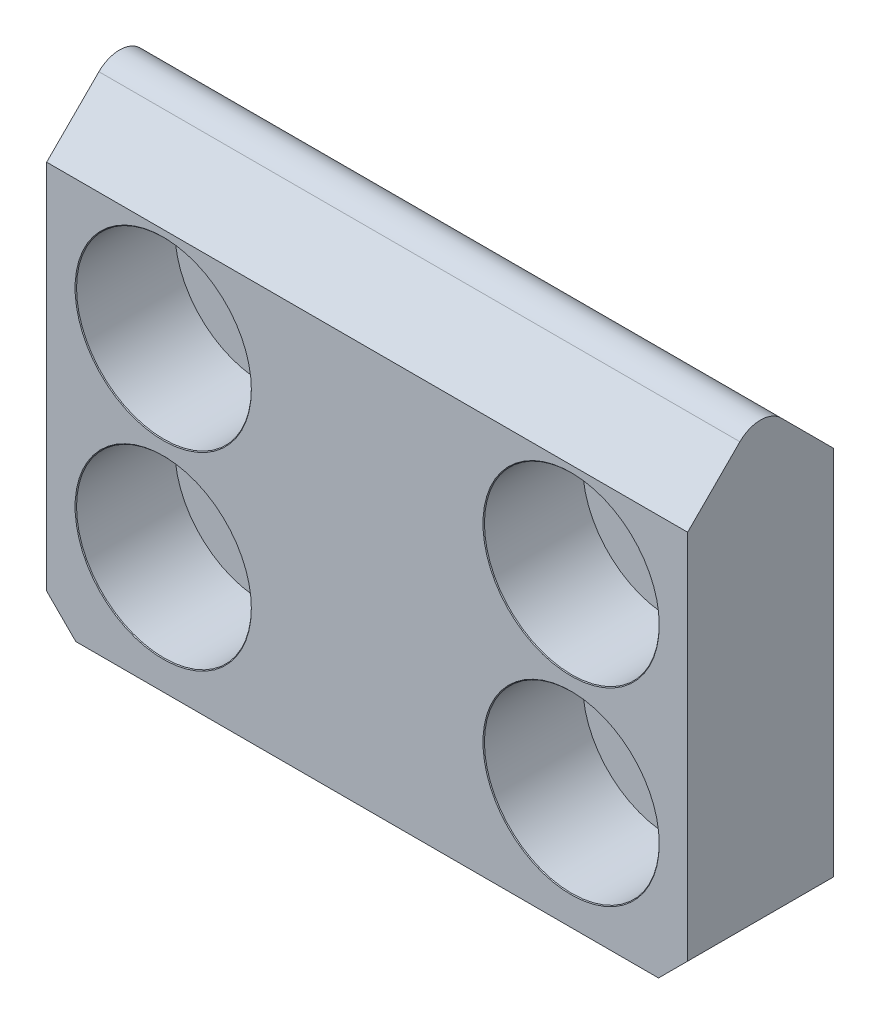
ISO-10303-21;
HEADER;
FILE_DESCRIPTION(('STEP AP214'),'2;1');
FILE_NAME('part.step','',(''),(''),'','','');
FILE_SCHEMA(('AUTOMOTIVE_DESIGN { 1 0 10303 214 1 1 1 1 }'));
ENDSEC;
DATA;
#1=APPLICATION_CONTEXT('core data for automotive mechanical design processes');
#2=APPLICATION_PROTOCOL_DEFINITION('international standard','automotive_design',2000,#1);
#3=PRODUCT_CONTEXT('',#1,'mechanical');
#4=PRODUCT('Part','Part','',(#3));
#5=PRODUCT_RELATED_PRODUCT_CATEGORY('part','',(#4));
#6=PRODUCT_DEFINITION_FORMATION('','',#4);
#7=PRODUCT_DEFINITION_CONTEXT('part definition',#1,'design');
#8=PRODUCT_DEFINITION('design','',#6,#7);
#9=PRODUCT_DEFINITION_SHAPE('','',#8);
#10=(LENGTH_UNIT() NAMED_UNIT(*) SI_UNIT(.MILLI.,.METRE.));
#11=(NAMED_UNIT(*) PLANE_ANGLE_UNIT() SI_UNIT($,.RADIAN.));
#12=(NAMED_UNIT(*) SI_UNIT($,.STERADIAN.) SOLID_ANGLE_UNIT());
#13=UNCERTAINTY_MEASURE_WITH_UNIT(LENGTH_MEASURE(1.E-05),#10,'distance_accuracy_value','');
#14=(GEOMETRIC_REPRESENTATION_CONTEXT(3) GLOBAL_UNCERTAINTY_ASSIGNED_CONTEXT((#13)) GLOBAL_UNIT_ASSIGNED_CONTEXT((#10,
#11,#12)) REPRESENTATION_CONTEXT('',''));
#15=CARTESIAN_POINT('',(0.,0.,0.));
#16=DIRECTION('',(0.,0.,1.));
#17=DIRECTION('',(1.,0.,0.));
#18=AXIS2_PLACEMENT_3D('',#15,#16,#17);
#19=CARTESIAN_POINT('',(11.,-11.25,5.));
#20=DIRECTION('',(-1.,0.,0.));
#21=DIRECTION('',(0.,-1.,0.));
#22=AXIS2_PLACEMENT_3D('',#19,#20,#21);
#23=PLANE('',#22);
#24=DIRECTION('',(0.,-0.707106781186549,-0.707106781186547));
#25=VECTOR('',#24,1.);
#26=CARTESIAN_POINT('',(11.,5.,2.50000000000001));
#27=LINE('',#26,#25);
#28=CARTESIAN_POINT('',(11.,2.49999999999999,0.));
#29=VERTEX_POINT('',#28);
#30=CARTESIAN_POINT('',(11.,4.29289321881344,1.79289321881345));
#31=VERTEX_POINT('',#30);
#32=EDGE_CURVE('E133',#29,#31,#27,.F.);
#33=ORIENTED_EDGE('',*,*,#32,.T.);
#34=CARTESIAN_POINT('',(11.,3.5857864376269,2.5));
#35=DIRECTION('',(-1.,0.,0.));
#36=DIRECTION('',(0.,-1.,0.));
#37=AXIS2_PLACEMENT_3D('',#34,#35,#36);
#38=CIRCLE('',#37,1.);
#39=CARTESIAN_POINT('',(11.,4.29289321881344,3.20710678118654));
#40=VERTEX_POINT('',#39);
#41=EDGE_CURVE('E65',#31,#40,#38,.F.);
#42=ORIENTED_EDGE('',*,*,#41,.T.);
#43=DIRECTION('',(0.,-0.707106781186547,0.707106781186549));
#44=VECTOR('',#43,1.);
#45=CARTESIAN_POINT('',(11.,2.49999999999999,5.));
#46=LINE('',#45,#44);
#47=CARTESIAN_POINT('',(11.,2.5,5.));
#48=VERTEX_POINT('',#47);
#49=EDGE_CURVE('E135',#40,#48,#46,.T.);
#50=ORIENTED_EDGE('',*,*,#49,.T.);
#51=DIRECTION('',(0.,1.,0.));
#52=VECTOR('',#51,1.);
#53=CARTESIAN_POINT('',(11.,-11.25,5.));
#54=LINE('',#53,#52);
#55=CARTESIAN_POINT('',(11.,-10.25,5.));
#56=VERTEX_POINT('',#55);
#57=EDGE_CURVE('E192',#56,#48,#54,.T.);
#58=ORIENTED_EDGE('',*,*,#57,.F.);
#59=DIRECTION('',(0.,0.,-1.));
#60=VECTOR('',#59,1.);
#61=CARTESIAN_POINT('',(11.,-10.25,5.));
#62=LINE('',#61,#60);
#63=CARTESIAN_POINT('',(11.,-10.25,0.));
#64=VERTEX_POINT('',#63);
#65=EDGE_CURVE('E146',#56,#64,#62,.T.);
#66=ORIENTED_EDGE('',*,*,#65,.T.);
#67=DIRECTION('',(0.,1.,0.));
#68=VECTOR('',#67,1.);
#69=CARTESIAN_POINT('',(11.,-11.25,0.));
#70=LINE('',#69,#68);
#71=EDGE_CURVE('E129',#64,#29,#70,.T.);
#72=ORIENTED_EDGE('',*,*,#71,.T.);
#73=EDGE_LOOP('',(#33,#42,#50,#58,#66,#72));
#74=FACE_BOUND('',#73,.T.);
#75=ADVANCED_FACE('F42',(#74),#23,.F.);
#76=CARTESIAN_POINT('',(-11.,-11.25,5.));
#77=DIRECTION('',(1.,0.,0.));
#78=DIRECTION('',(0.,1.,0.));
#79=AXIS2_PLACEMENT_3D('',#76,#77,#78);
#80=PLANE('',#79);
#81=DIRECTION('',(0.,0.707106781186547,-0.707106781186549));
#82=VECTOR('',#81,1.);
#83=CARTESIAN_POINT('',(-11.,2.49999999999999,5.));
#84=LINE('',#83,#82);
#85=CARTESIAN_POINT('',(-11.,2.49999999999999,5.));
#86=VERTEX_POINT('',#85);
#87=CARTESIAN_POINT('',(-11.,4.29289321881344,3.20710678118654));
#88=VERTEX_POINT('',#87);
#89=EDGE_CURVE('E119',#86,#88,#84,.T.);
#90=ORIENTED_EDGE('',*,*,#89,.T.);
#91=CARTESIAN_POINT('',(-11.,3.58578643762689,2.5));
#92=DIRECTION('',(1.,0.,0.));
#93=DIRECTION('',(0.,1.,0.));
#94=AXIS2_PLACEMENT_3D('',#91,#92,#93);
#95=CIRCLE('',#94,1.);
#96=CARTESIAN_POINT('',(-11.,4.29289321881344,1.79289321881345));
#97=VERTEX_POINT('',#96);
#98=EDGE_CURVE('E11',#88,#97,#95,.F.);
#99=ORIENTED_EDGE('',*,*,#98,.T.);
#100=DIRECTION('',(0.,0.707106781186549,0.707106781186547));
#101=VECTOR('',#100,1.);
#102=CARTESIAN_POINT('',(-11.,5.,2.50000000000001));
#103=LINE('',#102,#101);
#104=CARTESIAN_POINT('',(-11.,2.49999999999998,0.));
#105=VERTEX_POINT('',#104);
#106=EDGE_CURVE('E107',#97,#105,#103,.F.);
#107=ORIENTED_EDGE('',*,*,#106,.T.);
#108=DIRECTION('',(0.,-1.,0.));
#109=VECTOR('',#108,1.);
#110=CARTESIAN_POINT('',(-11.,-11.25,0.));
#111=LINE('',#110,#109);
#112=CARTESIAN_POINT('',(-11.,-10.25,0.));
#113=VERTEX_POINT('',#112);
#114=EDGE_CURVE('E110',#105,#113,#111,.T.);
#115=ORIENTED_EDGE('',*,*,#114,.T.);
#116=DIRECTION('',(0.,0.,1.));
#117=VECTOR('',#116,1.);
#118=CARTESIAN_POINT('',(-11.,-10.25,5.));
#119=LINE('',#118,#117);
#120=CARTESIAN_POINT('',(-11.,-10.25,5.));
#121=VERTEX_POINT('',#120);
#122=EDGE_CURVE('E168',#113,#121,#119,.T.);
#123=ORIENTED_EDGE('',*,*,#122,.T.);
#124=DIRECTION('',(0.,-1.,0.));
#125=VECTOR('',#124,1.);
#126=CARTESIAN_POINT('',(-11.,-11.25,5.));
#127=LINE('',#126,#125);
#128=EDGE_CURVE('E197',#86,#121,#127,.T.);
#129=ORIENTED_EDGE('',*,*,#128,.F.);
#130=EDGE_LOOP('',(#90,#99,#107,#115,#123,#129));
#131=FACE_BOUND('',#130,.T.);
#132=ADVANCED_FACE('F109',(#131),#80,.F.);
#133=CARTESIAN_POINT('',(11.,-11.25,5.));
#134=DIRECTION('',(0.,1.,0.));
#135=DIRECTION('',(0.,0.,1.));
#136=AXIS2_PLACEMENT_3D('',#133,#134,#135);
#137=PLANE('',#136);
#138=DIRECTION('',(1.,0.,0.));
#139=VECTOR('',#138,1.);
#140=CARTESIAN_POINT('',(11.,-11.25,0.));
#141=LINE('',#140,#139);
#142=CARTESIAN_POINT('',(-9.99999999999999,-11.25,0.));
#143=VERTEX_POINT('',#142);
#144=CARTESIAN_POINT('',(9.99999999999999,-11.25,0.));
#145=VERTEX_POINT('',#144);
#146=EDGE_CURVE('E128',#143,#145,#141,.T.);
#147=ORIENTED_EDGE('',*,*,#146,.T.);
#148=DIRECTION('',(0.,0.,1.));
#149=VECTOR('',#148,1.);
#150=CARTESIAN_POINT('',(9.99999999999999,-11.25,5.));
#151=LINE('',#150,#149);
#152=CARTESIAN_POINT('',(9.99999999999999,-11.25,5.));
#153=VERTEX_POINT('',#152);
#154=EDGE_CURVE('E159',#145,#153,#151,.T.);
#155=ORIENTED_EDGE('',*,*,#154,.T.);
#156=DIRECTION('',(1.,0.,0.));
#157=VECTOR('',#156,1.);
#158=CARTESIAN_POINT('',(11.,-11.25,5.));
#159=LINE('',#158,#157);
#160=CARTESIAN_POINT('',(-9.99999999999999,-11.25,5.));
#161=VERTEX_POINT('',#160);
#162=EDGE_CURVE('E187',#161,#153,#159,.T.);
#163=ORIENTED_EDGE('',*,*,#162,.F.);
#164=DIRECTION('',(0.,0.,-1.));
#165=VECTOR('',#164,1.);
#166=CARTESIAN_POINT('',(-9.99999999999999,-11.25,5.));
#167=LINE('',#166,#165);
#168=EDGE_CURVE('E155',#161,#143,#167,.T.);
#169=ORIENTED_EDGE('',*,*,#168,.T.);
#170=EDGE_LOOP('',(#147,#155,#163,#169));
#171=FACE_BOUND('',#170,.T.);
#172=ADVANCED_FACE('F289',(#171),#137,.F.);
#173=CARTESIAN_POINT('',(0.,0.,5.));
#174=DIRECTION('',(0.,0.,1.));
#175=DIRECTION('',(1.,0.,0.));
#176=AXIS2_PLACEMENT_3D('',#173,#174,#175);
#177=PLANE('',#176);
#178=CARTESIAN_POINT('',(-7.,-0.749999999999992,5.));
#179=DIRECTION('',(0.,0.,1.));
#180=DIRECTION('',(1.,0.,0.));
#181=AXIS2_PLACEMENT_3D('',#178,#179,#180);
#182=CIRCLE('',#181,3.025);
#183=CARTESIAN_POINT('',(-3.975,-0.749999999999992,5.));
#184=VERTEX_POINT('',#183);
#185=EDGE_CURVE('E279',#184,#184,#182,.T.);
#186=ORIENTED_EDGE('',*,*,#185,.F.);
#187=EDGE_LOOP('',(#186));
#188=FACE_BOUND('',#187,.T.);
#189=CARTESIAN_POINT('',(-7.,-7.24999999999999,5.));
#190=DIRECTION('',(0.,0.,1.));
#191=DIRECTION('',(1.,0.,0.));
#192=AXIS2_PLACEMENT_3D('',#189,#190,#191);
#193=CIRCLE('',#192,3.025);
#194=CARTESIAN_POINT('',(-3.975,-7.24999999999999,5.));
#195=VERTEX_POINT('',#194);
#196=EDGE_CURVE('E259',#195,#195,#193,.T.);
#197=ORIENTED_EDGE('',*,*,#196,.F.);
#198=EDGE_LOOP('',(#197));
#199=FACE_BOUND('',#198,.T.);
#200=CARTESIAN_POINT('',(7.,-0.749999999999991,5.));
#201=DIRECTION('',(0.,0.,1.));
#202=DIRECTION('',(1.,0.,0.));
#203=AXIS2_PLACEMENT_3D('',#200,#201,#202);
#204=CIRCLE('',#203,3.025);
#205=CARTESIAN_POINT('',(10.025,-0.749999999999991,5.));
#206=VERTEX_POINT('',#205);
#207=EDGE_CURVE('E239',#206,#206,#204,.T.);
#208=ORIENTED_EDGE('',*,*,#207,.F.);
#209=EDGE_LOOP('',(#208));
#210=FACE_BOUND('',#209,.T.);
#211=CARTESIAN_POINT('',(7.,-7.24999999999999,5.));
#212=DIRECTION('',(0.,0.,1.));
#213=DIRECTION('',(1.,0.,0.));
#214=AXIS2_PLACEMENT_3D('',#211,#212,#213);
#215=CIRCLE('',#214,3.025);
#216=CARTESIAN_POINT('',(10.025,-7.24999999999999,5.));
#217=VERTEX_POINT('',#216);
#218=EDGE_CURVE('E219',#217,#217,#215,.T.);
#219=ORIENTED_EDGE('',*,*,#218,.F.);
#220=EDGE_LOOP('',(#219));
#221=FACE_BOUND('',#220,.T.);
#222=ORIENTED_EDGE('',*,*,#162,.T.);
#223=DIRECTION('',(-0.707106781186549,-0.707106781186546,0.));
#224=VECTOR('',#223,1.);
#225=CARTESIAN_POINT('',(10.625,-10.625,5.));
#226=LINE('',#225,#224);
#227=EDGE_CURVE('E165',#153,#56,#226,.F.);
#228=ORIENTED_EDGE('',*,*,#227,.T.);
#229=ORIENTED_EDGE('',*,*,#57,.T.);
#230=DIRECTION('',(-1.,0.,0.));
#231=VECTOR('',#230,1.);
#232=CARTESIAN_POINT('',(-11.,2.49999999999999,5.));
#233=LINE('',#232,#231);
#234=EDGE_CURVE('E143',#48,#86,#233,.T.);
#235=ORIENTED_EDGE('',*,*,#234,.T.);
#236=ORIENTED_EDGE('',*,*,#128,.T.);
#237=DIRECTION('',(-0.707106781186548,0.707106781186548,0.));
#238=VECTOR('',#237,1.);
#239=CARTESIAN_POINT('',(-10.625,-10.625,5.));
#240=LINE('',#239,#238);
#241=EDGE_CURVE('E162',#121,#161,#240,.F.);
#242=ORIENTED_EDGE('',*,*,#241,.T.);
#243=EDGE_LOOP('',(#222,#228,#229,#235,#236,#242));
#244=FACE_BOUND('',#243,.T.);
#245=ADVANCED_FACE('F286',(#188,#199,#210,#221,#244),#177,.T.);
#246=CARTESIAN_POINT('',(0.,0.,0.));
#247=DIRECTION('',(0.,0.,1.));
#248=DIRECTION('',(1.,0.,0.));
#249=AXIS2_PLACEMENT_3D('',#246,#247,#248);
#250=PLANE('',#249);
#251=CARTESIAN_POINT('',(-7.,-0.749999999999992,0.));
#252=DIRECTION('',(0.,0.,1.));
#253=DIRECTION('',(1.,0.,0.));
#254=AXIS2_PLACEMENT_3D('',#251,#252,#253);
#255=CIRCLE('',#254,1.6);
#256=CARTESIAN_POINT('',(-5.4,-0.749999999999992,0.));
#257=VERTEX_POINT('',#256);
#258=EDGE_CURVE('E263',#257,#257,#255,.T.);
#259=ORIENTED_EDGE('',*,*,#258,.T.);
#260=EDGE_LOOP('',(#259));
#261=FACE_BOUND('',#260,.T.);
#262=CARTESIAN_POINT('',(-7.,-7.24999999999999,0.));
#263=DIRECTION('',(0.,0.,1.));
#264=DIRECTION('',(1.,0.,0.));
#265=AXIS2_PLACEMENT_3D('',#262,#263,#264);
#266=CIRCLE('',#265,1.6);
#267=CARTESIAN_POINT('',(-5.4,-7.24999999999999,0.));
#268=VERTEX_POINT('',#267);
#269=EDGE_CURVE('E243',#268,#268,#266,.T.);
#270=ORIENTED_EDGE('',*,*,#269,.T.);
#271=EDGE_LOOP('',(#270));
#272=FACE_BOUND('',#271,.T.);
#273=CARTESIAN_POINT('',(7.,-0.749999999999991,0.));
#274=DIRECTION('',(0.,0.,1.));
#275=DIRECTION('',(1.,0.,0.));
#276=AXIS2_PLACEMENT_3D('',#273,#274,#275);
#277=CIRCLE('',#276,1.6);
#278=CARTESIAN_POINT('',(8.6,-0.749999999999991,0.));
#279=VERTEX_POINT('',#278);
#280=EDGE_CURVE('E223',#279,#279,#277,.T.);
#281=ORIENTED_EDGE('',*,*,#280,.T.);
#282=EDGE_LOOP('',(#281));
#283=FACE_BOUND('',#282,.T.);
#284=CARTESIAN_POINT('',(7.,-7.24999999999999,0.));
#285=DIRECTION('',(0.,0.,1.));
#286=DIRECTION('',(1.,0.,0.));
#287=AXIS2_PLACEMENT_3D('',#284,#285,#286);
#288=CIRCLE('',#287,1.6);
#289=CARTESIAN_POINT('',(8.6,-7.24999999999999,0.));
#290=VERTEX_POINT('',#289);
#291=EDGE_CURVE('E180',#290,#290,#288,.T.);
#292=ORIENTED_EDGE('',*,*,#291,.T.);
#293=EDGE_LOOP('',(#292));
#294=FACE_BOUND('',#293,.T.);
#295=ORIENTED_EDGE('',*,*,#71,.F.);
#296=DIRECTION('',(0.707106781186549,0.707106781186546,0.));
#297=VECTOR('',#296,1.);
#298=CARTESIAN_POINT('',(11.,-10.25,0.));
#299=LINE('',#298,#297);
#300=EDGE_CURVE('E152',#64,#145,#299,.F.);
#301=ORIENTED_EDGE('',*,*,#300,.T.);
#302=ORIENTED_EDGE('',*,*,#146,.F.);
#303=DIRECTION('',(0.707106781186548,-0.707106781186548,0.));
#304=VECTOR('',#303,1.);
#305=CARTESIAN_POINT('',(-9.99999999999999,-11.25,0.));
#306=LINE('',#305,#304);
#307=EDGE_CURVE('E126',#143,#113,#306,.F.);
#308=ORIENTED_EDGE('',*,*,#307,.T.);
#309=ORIENTED_EDGE('',*,*,#114,.F.);
#310=DIRECTION('',(1.,0.,0.));
#311=VECTOR('',#310,1.);
#312=CARTESIAN_POINT('',(0.,2.49999999999999,0.));
#313=LINE('',#312,#311);
#314=EDGE_CURVE('E118',#105,#29,#313,.T.);
#315=ORIENTED_EDGE('',*,*,#314,.T.);
#316=EDGE_LOOP('',(#295,#301,#302,#308,#309,#315));
#317=FACE_BOUND('',#316,.T.);
#318=ADVANCED_FACE('F124',(#261,#272,#283,#294,#317),#250,.F.);
#319=CARTESIAN_POINT('',(0.,2.49999999999999,5.));
#320=DIRECTION('',(0.,0.707106781186549,0.707106781186547));
#321=DIRECTION('',(1.,0.,0.));
#322=AXIS2_PLACEMENT_3D('',#319,#320,#321);
#323=PLANE('',#322);
#324=ORIENTED_EDGE('',*,*,#49,.F.);
#325=DIRECTION('',(-1.,0.,0.));
#326=VECTOR('',#325,1.);
#327=CARTESIAN_POINT('',(0.,4.29289321881344,3.20710678118654));
#328=LINE('',#327,#326);
#329=EDGE_CURVE('E51',#40,#88,#328,.T.);
#330=ORIENTED_EDGE('',*,*,#329,.T.);
#331=ORIENTED_EDGE('',*,*,#89,.F.);
#332=ORIENTED_EDGE('',*,*,#234,.F.);
#333=EDGE_LOOP('',(#324,#330,#331,#332));
#334=FACE_BOUND('',#333,.T.);
#335=ADVANCED_FACE('F330',(#334),#323,.T.);
#336=CARTESIAN_POINT('',(11.,5.,2.50000000000001));
#337=DIRECTION('',(0.,-0.707106781186547,0.707106781186549));
#338=DIRECTION('',(-1.,0.,0.));
#339=AXIS2_PLACEMENT_3D('',#336,#337,#338);
#340=PLANE('',#339);
#341=ORIENTED_EDGE('',*,*,#106,.F.);
#342=DIRECTION('',(1.,0.,0.));
#343=VECTOR('',#342,1.);
#344=CARTESIAN_POINT('',(11.,4.29289321881344,1.79289321881345));
#345=LINE('',#344,#343);
#346=EDGE_CURVE('E171',#97,#31,#345,.T.);
#347=ORIENTED_EDGE('',*,*,#346,.T.);
#348=ORIENTED_EDGE('',*,*,#32,.F.);
#349=ORIENTED_EDGE('',*,*,#314,.F.);
#350=EDGE_LOOP('',(#341,#347,#348,#349));
#351=FACE_BOUND('',#350,.T.);
#352=ADVANCED_FACE('F132',(#351),#340,.F.);
#353=CARTESIAN_POINT('',(11.,-10.25,5.));
#354=DIRECTION('',(-0.707106781186546,0.707106781186549,0.));
#355=DIRECTION('',(0.,0.,-1.));
#356=AXIS2_PLACEMENT_3D('',#353,#354,#355);
#357=PLANE('',#356);
#358=ORIENTED_EDGE('',*,*,#227,.F.);
#359=ORIENTED_EDGE('',*,*,#154,.F.);
#360=ORIENTED_EDGE('',*,*,#300,.F.);
#361=ORIENTED_EDGE('',*,*,#65,.F.);
#362=EDGE_LOOP('',(#358,#359,#360,#361));
#363=FACE_BOUND('',#362,.T.);
#364=ADVANCED_FACE('F329',(#363),#357,.F.);
#365=CARTESIAN_POINT('',(-9.99999999999999,-11.25,5.));
#366=DIRECTION('',(0.707106781186548,0.707106781186548,0.));
#367=DIRECTION('',(0.,0.,-1.));
#368=AXIS2_PLACEMENT_3D('',#365,#366,#367);
#369=PLANE('',#368);
#370=ORIENTED_EDGE('',*,*,#241,.F.);
#371=ORIENTED_EDGE('',*,*,#122,.F.);
#372=ORIENTED_EDGE('',*,*,#307,.F.);
#373=ORIENTED_EDGE('',*,*,#168,.F.);
#374=EDGE_LOOP('',(#370,#371,#372,#373));
#375=FACE_BOUND('',#374,.T.);
#376=ADVANCED_FACE('F339',(#375),#369,.F.);
#377=CARTESIAN_POINT('',(7.,-7.24999999999999,5.));
#378=DIRECTION('',(0.,0.,1.));
#379=DIRECTION('',(1.,0.,0.));
#380=AXIS2_PLACEMENT_3D('',#377,#378,#379);
#381=CYLINDRICAL_SURFACE('',#380,1.6);
#382=ORIENTED_EDGE('',*,*,#291,.F.);
#383=EDGE_LOOP('',(#382));
#384=FACE_BOUND('',#383,.T.);
#385=CARTESIAN_POINT('',(7.,-7.24999999999999,1.6));
#386=DIRECTION('',(0.,0.,1.));
#387=DIRECTION('',(1.,0.,0.));
#388=AXIS2_PLACEMENT_3D('',#385,#386,#387);
#389=CIRCLE('',#388,1.6);
#390=CARTESIAN_POINT('',(8.6,-7.24999999999999,1.6));
#391=VERTEX_POINT('',#390);
#392=EDGE_CURVE('E184',#391,#391,#389,.T.);
#393=ORIENTED_EDGE('',*,*,#392,.T.);
#394=EDGE_LOOP('',(#393));
#395=FACE_BOUND('',#394,.T.);
#396=ADVANCED_FACE('F344',(#384,#395),#381,.F.);
#397=CARTESIAN_POINT('',(8.6,-7.24999999999999,1.6));
#398=DIRECTION('',(0.,0.,-1.));
#399=DIRECTION('',(-1.,0.,0.));
#400=AXIS2_PLACEMENT_3D('',#397,#398,#399);
#401=PLANE('',#400);
#402=ORIENTED_EDGE('',*,*,#392,.F.);
#403=EDGE_LOOP('',(#402));
#404=FACE_BOUND('',#403,.T.);
#405=CARTESIAN_POINT('',(7.,-7.24999999999999,1.6));
#406=DIRECTION('',(0.,0.,1.));
#407=DIRECTION('',(1.,0.,0.));
#408=AXIS2_PLACEMENT_3D('',#405,#406,#407);
#409=CIRCLE('',#408,3.);
#410=CARTESIAN_POINT('',(10.,-7.24999999999999,1.6));
#411=VERTEX_POINT('',#410);
#412=EDGE_CURVE('E211',#411,#411,#409,.T.);
#413=ORIENTED_EDGE('',*,*,#412,.T.);
#414=EDGE_LOOP('',(#413));
#415=FACE_BOUND('',#414,.T.);
#416=ADVANCED_FACE('F310',(#404,#415),#401,.F.);
#417=CARTESIAN_POINT('',(7.,-7.24999999999999,5.));
#418=DIRECTION('',(0.,0.,1.));
#419=DIRECTION('',(1.,0.,0.));
#420=AXIS2_PLACEMENT_3D('',#417,#418,#419);
#421=CYLINDRICAL_SURFACE('',#420,3.);
#422=ORIENTED_EDGE('',*,*,#412,.F.);
#423=EDGE_LOOP('',(#422));
#424=FACE_BOUND('',#423,.T.);
#425=CARTESIAN_POINT('',(7.,-7.24999999999999,4.975));
#426=DIRECTION('',(0.,0.,1.));
#427=DIRECTION('',(1.,0.,0.));
#428=AXIS2_PLACEMENT_3D('',#425,#426,#427);
#429=CIRCLE('',#428,3.);
#430=CARTESIAN_POINT('',(10.,-7.24999999999999,4.975));
#431=VERTEX_POINT('',#430);
#432=EDGE_CURVE('E215',#431,#431,#429,.T.);
#433=ORIENTED_EDGE('',*,*,#432,.T.);
#434=EDGE_LOOP('',(#433));
#435=FACE_BOUND('',#434,.T.);
#436=ADVANCED_FACE('F300',(#424,#435),#421,.F.);
#437=CARTESIAN_POINT('',(7.,-7.24999999999999,5.));
#438=DIRECTION('',(0.,0.,1.));
#439=DIRECTION('',(1.,0.,0.));
#440=AXIS2_PLACEMENT_3D('',#437,#438,#439);
#441=CONICAL_SURFACE('',#440,3.025,0.785398163397396);
#442=ORIENTED_EDGE('',*,*,#432,.F.);
#443=EDGE_LOOP('',(#442));
#444=FACE_BOUND('',#443,.T.);
#445=ORIENTED_EDGE('',*,*,#218,.T.);
#446=EDGE_LOOP('',(#445));
#447=FACE_BOUND('',#446,.T.);
#448=ADVANCED_FACE('F297',(#444,#447),#441,.F.);
#449=CARTESIAN_POINT('',(7.,-0.749999999999991,5.));
#450=DIRECTION('',(0.,0.,1.));
#451=DIRECTION('',(1.,0.,0.));
#452=AXIS2_PLACEMENT_3D('',#449,#450,#451);
#453=CYLINDRICAL_SURFACE('',#452,1.6);
#454=ORIENTED_EDGE('',*,*,#280,.F.);
#455=EDGE_LOOP('',(#454));
#456=FACE_BOUND('',#455,.T.);
#457=CARTESIAN_POINT('',(7.,-0.749999999999991,1.6));
#458=DIRECTION('',(0.,0.,1.));
#459=DIRECTION('',(1.,0.,0.));
#460=AXIS2_PLACEMENT_3D('',#457,#458,#459);
#461=CIRCLE('',#460,1.6);
#462=CARTESIAN_POINT('',(8.6,-0.749999999999991,1.6));
#463=VERTEX_POINT('',#462);
#464=EDGE_CURVE('E227',#463,#463,#461,.T.);
#465=ORIENTED_EDGE('',*,*,#464,.T.);
#466=EDGE_LOOP('',(#465));
#467=FACE_BOUND('',#466,.T.);
#468=ADVANCED_FACE('F299',(#456,#467),#453,.F.);
#469=CARTESIAN_POINT('',(8.6,-0.749999999999991,1.6));
#470=DIRECTION('',(0.,0.,-1.));
#471=DIRECTION('',(-1.,0.,0.));
#472=AXIS2_PLACEMENT_3D('',#469,#470,#471);
#473=PLANE('',#472);
#474=ORIENTED_EDGE('',*,*,#464,.F.);
#475=EDGE_LOOP('',(#474));
#476=FACE_BOUND('',#475,.T.);
#477=CARTESIAN_POINT('',(7.,-0.749999999999991,1.6));
#478=DIRECTION('',(0.,0.,1.));
#479=DIRECTION('',(1.,0.,0.));
#480=AXIS2_PLACEMENT_3D('',#477,#478,#479);
#481=CIRCLE('',#480,3.);
#482=CARTESIAN_POINT('',(10.,-0.749999999999991,1.6));
#483=VERTEX_POINT('',#482);
#484=EDGE_CURVE('E231',#483,#483,#481,.T.);
#485=ORIENTED_EDGE('',*,*,#484,.T.);
#486=EDGE_LOOP('',(#485));
#487=FACE_BOUND('',#486,.T.);
#488=ADVANCED_FACE('F307',(#476,#487),#473,.F.);
#489=CARTESIAN_POINT('',(7.,-0.749999999999991,5.));
#490=DIRECTION('',(0.,0.,1.));
#491=DIRECTION('',(1.,0.,0.));
#492=AXIS2_PLACEMENT_3D('',#489,#490,#491);
#493=CYLINDRICAL_SURFACE('',#492,3.);
#494=ORIENTED_EDGE('',*,*,#484,.F.);
#495=EDGE_LOOP('',(#494));
#496=FACE_BOUND('',#495,.T.);
#497=CARTESIAN_POINT('',(7.,-0.749999999999991,4.975));
#498=DIRECTION('',(0.,0.,1.));
#499=DIRECTION('',(1.,0.,0.));
#500=AXIS2_PLACEMENT_3D('',#497,#498,#499);
#501=CIRCLE('',#500,3.);
#502=CARTESIAN_POINT('',(10.,-0.749999999999991,4.975));
#503=VERTEX_POINT('',#502);
#504=EDGE_CURVE('E235',#503,#503,#501,.T.);
#505=ORIENTED_EDGE('',*,*,#504,.T.);
#506=EDGE_LOOP('',(#505));
#507=FACE_BOUND('',#506,.T.);
#508=ADVANCED_FACE('F396',(#496,#507),#493,.F.);
#509=CARTESIAN_POINT('',(7.,-0.749999999999991,5.));
#510=DIRECTION('',(0.,0.,1.));
#511=DIRECTION('',(1.,0.,0.));
#512=AXIS2_PLACEMENT_3D('',#509,#510,#511);
#513=CONICAL_SURFACE('',#512,3.025,0.785398163397396);
#514=ORIENTED_EDGE('',*,*,#504,.F.);
#515=EDGE_LOOP('',(#514));
#516=FACE_BOUND('',#515,.T.);
#517=ORIENTED_EDGE('',*,*,#207,.T.);
#518=EDGE_LOOP('',(#517));
#519=FACE_BOUND('',#518,.T.);
#520=ADVANCED_FACE('F392',(#516,#519),#513,.F.);
#521=CARTESIAN_POINT('',(-7.,-7.24999999999999,5.));
#522=DIRECTION('',(0.,0.,1.));
#523=DIRECTION('',(1.,0.,0.));
#524=AXIS2_PLACEMENT_3D('',#521,#522,#523);
#525=CYLINDRICAL_SURFACE('',#524,1.6);
#526=ORIENTED_EDGE('',*,*,#269,.F.);
#527=EDGE_LOOP('',(#526));
#528=FACE_BOUND('',#527,.T.);
#529=CARTESIAN_POINT('',(-7.,-7.24999999999999,1.6));
#530=DIRECTION('',(0.,0.,1.));
#531=DIRECTION('',(1.,0.,0.));
#532=AXIS2_PLACEMENT_3D('',#529,#530,#531);
#533=CIRCLE('',#532,1.6);
#534=CARTESIAN_POINT('',(-5.4,-7.24999999999999,1.6));
#535=VERTEX_POINT('',#534);
#536=EDGE_CURVE('E247',#535,#535,#533,.T.);
#537=ORIENTED_EDGE('',*,*,#536,.T.);
#538=EDGE_LOOP('',(#537));
#539=FACE_BOUND('',#538,.T.);
#540=ADVANCED_FACE('F388',(#528,#539),#525,.F.);
#541=CARTESIAN_POINT('',(-5.4,-7.24999999999999,1.6));
#542=DIRECTION('',(0.,0.,-1.));
#543=DIRECTION('',(-1.,0.,0.));
#544=AXIS2_PLACEMENT_3D('',#541,#542,#543);
#545=PLANE('',#544);
#546=ORIENTED_EDGE('',*,*,#536,.F.);
#547=EDGE_LOOP('',(#546));
#548=FACE_BOUND('',#547,.T.);
#549=CARTESIAN_POINT('',(-7.,-7.24999999999999,1.6));
#550=DIRECTION('',(0.,0.,1.));
#551=DIRECTION('',(1.,0.,0.));
#552=AXIS2_PLACEMENT_3D('',#549,#550,#551);
#553=CIRCLE('',#552,3.);
#554=CARTESIAN_POINT('',(-4.00000000000001,-7.24999999999999,1.6));
#555=VERTEX_POINT('',#554);
#556=EDGE_CURVE('E251',#555,#555,#553,.T.);
#557=ORIENTED_EDGE('',*,*,#556,.T.);
#558=EDGE_LOOP('',(#557));
#559=FACE_BOUND('',#558,.T.);
#560=ADVANCED_FACE('F384',(#548,#559),#545,.F.);
#561=CARTESIAN_POINT('',(-7.,-7.24999999999999,5.));
#562=DIRECTION('',(0.,0.,1.));
#563=DIRECTION('',(1.,0.,0.));
#564=AXIS2_PLACEMENT_3D('',#561,#562,#563);
#565=CYLINDRICAL_SURFACE('',#564,3.);
#566=ORIENTED_EDGE('',*,*,#556,.F.);
#567=EDGE_LOOP('',(#566));
#568=FACE_BOUND('',#567,.T.);
#569=CARTESIAN_POINT('',(-7.,-7.24999999999999,4.975));
#570=DIRECTION('',(0.,0.,1.));
#571=DIRECTION('',(1.,0.,0.));
#572=AXIS2_PLACEMENT_3D('',#569,#570,#571);
#573=CIRCLE('',#572,3.);
#574=CARTESIAN_POINT('',(-4.,-7.24999999999999,4.975));
#575=VERTEX_POINT('',#574);
#576=EDGE_CURVE('E255',#575,#575,#573,.T.);
#577=ORIENTED_EDGE('',*,*,#576,.T.);
#578=EDGE_LOOP('',(#577));
#579=FACE_BOUND('',#578,.T.);
#580=ADVANCED_FACE('F380',(#568,#579),#565,.F.);
#581=CARTESIAN_POINT('',(-7.,-7.24999999999999,5.));
#582=DIRECTION('',(0.,0.,1.));
#583=DIRECTION('',(1.,0.,0.));
#584=AXIS2_PLACEMENT_3D('',#581,#582,#583);
#585=CONICAL_SURFACE('',#584,3.025,0.785398163397396);
#586=ORIENTED_EDGE('',*,*,#576,.F.);
#587=EDGE_LOOP('',(#586));
#588=FACE_BOUND('',#587,.T.);
#589=ORIENTED_EDGE('',*,*,#196,.T.);
#590=EDGE_LOOP('',(#589));
#591=FACE_BOUND('',#590,.T.);
#592=ADVANCED_FACE('F376',(#588,#591),#585,.F.);
#593=CARTESIAN_POINT('',(-7.,-0.749999999999992,5.));
#594=DIRECTION('',(0.,0.,1.));
#595=DIRECTION('',(1.,0.,0.));
#596=AXIS2_PLACEMENT_3D('',#593,#594,#595);
#597=CYLINDRICAL_SURFACE('',#596,1.6);
#598=ORIENTED_EDGE('',*,*,#258,.F.);
#599=EDGE_LOOP('',(#598));
#600=FACE_BOUND('',#599,.T.);
#601=CARTESIAN_POINT('',(-7.,-0.749999999999992,1.6));
#602=DIRECTION('',(0.,0.,1.));
#603=DIRECTION('',(1.,0.,0.));
#604=AXIS2_PLACEMENT_3D('',#601,#602,#603);
#605=CIRCLE('',#604,1.6);
#606=CARTESIAN_POINT('',(-5.4,-0.749999999999992,1.6));
#607=VERTEX_POINT('',#606);
#608=EDGE_CURVE('E267',#607,#607,#605,.T.);
#609=ORIENTED_EDGE('',*,*,#608,.T.);
#610=EDGE_LOOP('',(#609));
#611=FACE_BOUND('',#610,.T.);
#612=ADVANCED_FACE('F372',(#600,#611),#597,.F.);
#613=CARTESIAN_POINT('',(-5.4,-0.749999999999992,1.6));
#614=DIRECTION('',(0.,0.,-1.));
#615=DIRECTION('',(-1.,0.,0.));
#616=AXIS2_PLACEMENT_3D('',#613,#614,#615);
#617=PLANE('',#616);
#618=ORIENTED_EDGE('',*,*,#608,.F.);
#619=EDGE_LOOP('',(#618));
#620=FACE_BOUND('',#619,.T.);
#621=CARTESIAN_POINT('',(-7.,-0.749999999999992,1.6));
#622=DIRECTION('',(0.,0.,1.));
#623=DIRECTION('',(1.,0.,0.));
#624=AXIS2_PLACEMENT_3D('',#621,#622,#623);
#625=CIRCLE('',#624,3.);
#626=CARTESIAN_POINT('',(-4.,-0.749999999999992,1.6));
#627=VERTEX_POINT('',#626);
#628=EDGE_CURVE('E271',#627,#627,#625,.T.);
#629=ORIENTED_EDGE('',*,*,#628,.T.);
#630=EDGE_LOOP('',(#629));
#631=FACE_BOUND('',#630,.T.);
#632=ADVANCED_FACE('F365',(#620,#631),#617,.F.);
#633=CARTESIAN_POINT('',(-7.,-0.749999999999992,5.));
#634=DIRECTION('',(0.,0.,1.));
#635=DIRECTION('',(1.,0.,0.));
#636=AXIS2_PLACEMENT_3D('',#633,#634,#635);
#637=CYLINDRICAL_SURFACE('',#636,3.);
#638=ORIENTED_EDGE('',*,*,#628,.F.);
#639=EDGE_LOOP('',(#638));
#640=FACE_BOUND('',#639,.T.);
#641=CARTESIAN_POINT('',(-7.,-0.749999999999992,4.975));
#642=DIRECTION('',(0.,0.,1.));
#643=DIRECTION('',(1.,0.,0.));
#644=AXIS2_PLACEMENT_3D('',#641,#642,#643);
#645=CIRCLE('',#644,3.);
#646=CARTESIAN_POINT('',(-4.,-0.749999999999992,4.975));
#647=VERTEX_POINT('',#646);
#648=EDGE_CURVE('E275',#647,#647,#645,.T.);
#649=ORIENTED_EDGE('',*,*,#648,.T.);
#650=EDGE_LOOP('',(#649));
#651=FACE_BOUND('',#650,.T.);
#652=ADVANCED_FACE('F359',(#640,#651),#637,.F.);
#653=CARTESIAN_POINT('',(-7.,-0.749999999999992,5.));
#654=DIRECTION('',(0.,0.,1.));
#655=DIRECTION('',(1.,0.,0.));
#656=AXIS2_PLACEMENT_3D('',#653,#654,#655);
#657=CONICAL_SURFACE('',#656,3.025,0.785398163397396);
#658=ORIENTED_EDGE('',*,*,#648,.F.);
#659=EDGE_LOOP('',(#658));
#660=FACE_BOUND('',#659,.T.);
#661=ORIENTED_EDGE('',*,*,#185,.T.);
#662=EDGE_LOOP('',(#661));
#663=FACE_BOUND('',#662,.T.);
#664=ADVANCED_FACE('F284',(#660,#663),#657,.F.);
#665=CARTESIAN_POINT('',(11.,3.5857864376269,2.5));
#666=DIRECTION('',(-1.,0.,0.));
#667=DIRECTION('',(0.,-1.,0.));
#668=AXIS2_PLACEMENT_3D('',#665,#666,#667);
#669=CYLINDRICAL_SURFACE('',#668,1.);
#670=ORIENTED_EDGE('',*,*,#98,.F.);
#671=ORIENTED_EDGE('',*,*,#329,.F.);
#672=ORIENTED_EDGE('',*,*,#41,.F.);
#673=ORIENTED_EDGE('',*,*,#346,.F.);
#674=EDGE_LOOP('',(#670,#671,#672,#673));
#675=FACE_BOUND('',#674,.T.);
#676=ADVANCED_FACE('F44',(#675),#669,.T.);
#677=CLOSED_SHELL('',(#75,#132,#172,#245,#318,#335,#352,#364,#376,#396,#416,#436,#448,#468,#488,
#508,#520,#540,#560,#580,#592,#612,#632,#652,#664,#676));
#678=MANIFOLD_SOLID_BREP('B2',#677);
#679=ADVANCED_BREP_SHAPE_REPRESENTATION('',(#18,#678),#14);
#680=SHAPE_DEFINITION_REPRESENTATION(#9,#679);
ENDSEC;
END-ISO-10303-21;
